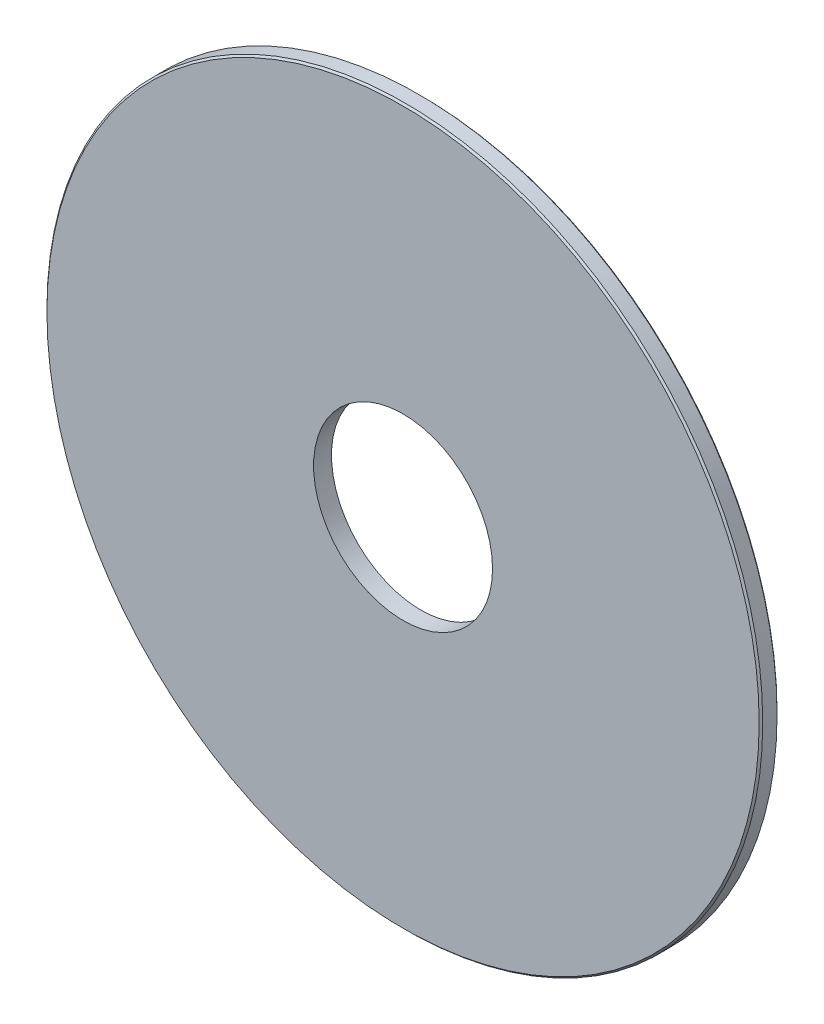
ISO-10303-21;
HEADER;
FILE_DESCRIPTION(('STEP AP214'),'2;1');
FILE_NAME('part.step','',(''),(''),'','','');
FILE_SCHEMA(('AUTOMOTIVE_DESIGN { 1 0 10303 214 1 1 1 1 }'));
ENDSEC;
DATA;
#1=APPLICATION_CONTEXT('core data for automotive mechanical design processes');
#2=APPLICATION_PROTOCOL_DEFINITION('international standard','automotive_design',2000,#1);
#3=PRODUCT_CONTEXT('',#1,'mechanical');
#4=PRODUCT('Part','Part','',(#3));
#5=PRODUCT_RELATED_PRODUCT_CATEGORY('part','',(#4));
#6=PRODUCT_DEFINITION_FORMATION('','',#4);
#7=PRODUCT_DEFINITION_CONTEXT('part definition',#1,'design');
#8=PRODUCT_DEFINITION('design','',#6,#7);
#9=PRODUCT_DEFINITION_SHAPE('','',#8);
#10=(LENGTH_UNIT() NAMED_UNIT(*) SI_UNIT(.MILLI.,.METRE.));
#11=(NAMED_UNIT(*) PLANE_ANGLE_UNIT() SI_UNIT($,.RADIAN.));
#12=(NAMED_UNIT(*) SI_UNIT($,.STERADIAN.) SOLID_ANGLE_UNIT());
#13=UNCERTAINTY_MEASURE_WITH_UNIT(LENGTH_MEASURE(1.E-05),#10,'distance_accuracy_value','');
#14=(GEOMETRIC_REPRESENTATION_CONTEXT(3) GLOBAL_UNCERTAINTY_ASSIGNED_CONTEXT((#13)) GLOBAL_UNIT_ASSIGNED_CONTEXT((#10,
#11,#12)) REPRESENTATION_CONTEXT('',''));
#15=CARTESIAN_POINT('',(0.,0.,0.));
#16=DIRECTION('',(0.,0.,1.));
#17=DIRECTION('',(1.,0.,0.));
#18=AXIS2_PLACEMENT_3D('',#15,#16,#17);
#19=CARTESIAN_POINT('',(0.,0.,2.));
#20=DIRECTION('',(0.,0.,1.));
#21=DIRECTION('',(1.,0.,0.));
#22=AXIS2_PLACEMENT_3D('',#19,#20,#21);
#23=PLANE('',#22);
#24=CARTESIAN_POINT('',(0.,0.,2.));
#25=DIRECTION('',(0.,0.,1.));
#26=DIRECTION('',(1.,0.,0.));
#27=AXIS2_PLACEMENT_3D('',#24,#25,#26);
#28=CIRCLE('',#27,39.8);
#29=CARTESIAN_POINT('',(39.8,0.,2.));
#30=VERTEX_POINT('',#29);
#31=EDGE_CURVE('E45',#30,#30,#28,.T.);
#32=ORIENTED_EDGE('',*,*,#31,.T.);
#33=EDGE_LOOP('',(#32));
#34=FACE_BOUND('',#33,.T.);
#35=CARTESIAN_POINT('',(0.,0.,2.));
#36=DIRECTION('',(0.,0.,1.));
#37=DIRECTION('',(1.,0.,0.));
#38=AXIS2_PLACEMENT_3D('',#35,#36,#37);
#39=CIRCLE('',#38,10.);
#40=CARTESIAN_POINT('',(10.,0.,2.));
#41=VERTEX_POINT('',#40);
#42=EDGE_CURVE('E50',#41,#41,#39,.T.);
#43=ORIENTED_EDGE('',*,*,#42,.F.);
#44=EDGE_LOOP('',(#43));
#45=FACE_BOUND('',#44,.T.);
#46=ADVANCED_FACE('F30',(#34,#45),#23,.T.);
#47=CARTESIAN_POINT('',(0.,0.,0.));
#48=DIRECTION('',(0.,0.,1.));
#49=DIRECTION('',(1.,0.,0.));
#50=AXIS2_PLACEMENT_3D('',#47,#48,#49);
#51=PLANE('',#50);
#52=CARTESIAN_POINT('',(0.,0.,0.));
#53=DIRECTION('',(0.,0.,1.));
#54=DIRECTION('',(1.,0.,0.));
#55=AXIS2_PLACEMENT_3D('',#52,#53,#54);
#56=CIRCLE('',#55,39.8);
#57=CARTESIAN_POINT('',(39.8,0.,0.));
#58=VERTEX_POINT('',#57);
#59=EDGE_CURVE('E10',#58,#58,#56,.F.);
#60=ORIENTED_EDGE('',*,*,#59,.T.);
#61=EDGE_LOOP('',(#60));
#62=FACE_BOUND('',#61,.T.);
#63=CARTESIAN_POINT('',(0.,0.,0.));
#64=DIRECTION('',(0.,0.,1.));
#65=DIRECTION('',(1.,0.,0.));
#66=AXIS2_PLACEMENT_3D('',#63,#64,#65);
#67=CIRCLE('',#66,10.);
#68=CARTESIAN_POINT('',(10.,0.,0.));
#69=VERTEX_POINT('',#68);
#70=EDGE_CURVE('E51',#69,#69,#67,.T.);
#71=ORIENTED_EDGE('',*,*,#70,.T.);
#72=EDGE_LOOP('',(#71));
#73=FACE_BOUND('',#72,.T.);
#74=ADVANCED_FACE('F61',(#62,#73),#51,.F.);
#75=CARTESIAN_POINT('',(0.,0.,2.));
#76=DIRECTION('',(0.,0.,-1.));
#77=DIRECTION('',(-1.,0.,0.));
#78=AXIS2_PLACEMENT_3D('',#75,#76,#77);
#79=CYLINDRICAL_SURFACE('',#78,40.);
#80=CARTESIAN_POINT('',(0.,0.,1.80000000000001));
#81=DIRECTION('',(0.,0.,1.));
#82=DIRECTION('',(1.,0.,0.));
#83=AXIS2_PLACEMENT_3D('',#80,#81,#82);
#84=CIRCLE('',#83,40.);
#85=CARTESIAN_POINT('',(40.,0.,1.80000000000001));
#86=VERTEX_POINT('',#85);
#87=EDGE_CURVE('E37',#86,#86,#84,.F.);
#88=ORIENTED_EDGE('',*,*,#87,.T.);
#89=EDGE_LOOP('',(#88));
#90=FACE_BOUND('',#89,.T.);
#91=CARTESIAN_POINT('',(0.,0.,0.199999999999992));
#92=DIRECTION('',(0.,0.,1.));
#93=DIRECTION('',(1.,0.,0.));
#94=AXIS2_PLACEMENT_3D('',#91,#92,#93);
#95=CIRCLE('',#94,40.);
#96=CARTESIAN_POINT('',(40.,0.,0.199999999999992));
#97=VERTEX_POINT('',#96);
#98=EDGE_CURVE('E41',#97,#97,#95,.T.);
#99=ORIENTED_EDGE('',*,*,#98,.T.);
#100=EDGE_LOOP('',(#99));
#101=FACE_BOUND('',#100,.T.);
#102=ADVANCED_FACE('F67',(#90,#101),#79,.T.);
#103=CARTESIAN_POINT('',(0.,0.,2.));
#104=DIRECTION('',(0.,0.,-1.));
#105=DIRECTION('',(-1.,0.,0.));
#106=AXIS2_PLACEMENT_3D('',#103,#104,#105);
#107=CYLINDRICAL_SURFACE('',#106,10.);
#108=ORIENTED_EDGE('',*,*,#42,.T.);
#109=EDGE_LOOP('',(#108));
#110=FACE_BOUND('',#109,.T.);
#111=ORIENTED_EDGE('',*,*,#70,.F.);
#112=EDGE_LOOP('',(#111));
#113=FACE_BOUND('',#112,.T.);
#114=ADVANCED_FACE('F57',(#110,#113),#107,.F.);
#115=CARTESIAN_POINT('',(0.,0.,2.));
#116=DIRECTION('',(0.,0.,-1.));
#117=DIRECTION('',(-1.,0.,0.));
#118=AXIS2_PLACEMENT_3D('',#115,#116,#117);
#119=CONICAL_SURFACE('',#118,39.8,0.785398163397448);
#120=ORIENTED_EDGE('',*,*,#87,.F.);
#121=EDGE_LOOP('',(#120));
#122=FACE_BOUND('',#121,.T.);
#123=ORIENTED_EDGE('',*,*,#31,.F.);
#124=EDGE_LOOP('',(#123));
#125=FACE_BOUND('',#124,.T.);
#126=ADVANCED_FACE('F72',(#122,#125),#119,.T.);
#127=CARTESIAN_POINT('',(0.,0.,0.199999999999992));
#128=DIRECTION('',(0.,0.,1.));
#129=DIRECTION('',(1.,0.,0.));
#130=AXIS2_PLACEMENT_3D('',#127,#128,#129);
#131=CONICAL_SURFACE('',#130,40.,0.785398163397448);
#132=ORIENTED_EDGE('',*,*,#59,.F.);
#133=EDGE_LOOP('',(#132));
#134=FACE_BOUND('',#133,.T.);
#135=ORIENTED_EDGE('',*,*,#98,.F.);
#136=EDGE_LOOP('',(#135));
#137=FACE_BOUND('',#136,.T.);
#138=ADVANCED_FACE('F32',(#134,#137),#131,.T.);
#139=CLOSED_SHELL('',(#46,#74,#102,#114,#126,#138));
#140=MANIFOLD_SOLID_BREP('B2',#139);
#141=ADVANCED_BREP_SHAPE_REPRESENTATION('',(#18,#140),#14);
#142=SHAPE_DEFINITION_REPRESENTATION(#9,#141);
ENDSEC;
END-ISO-10303-21;
